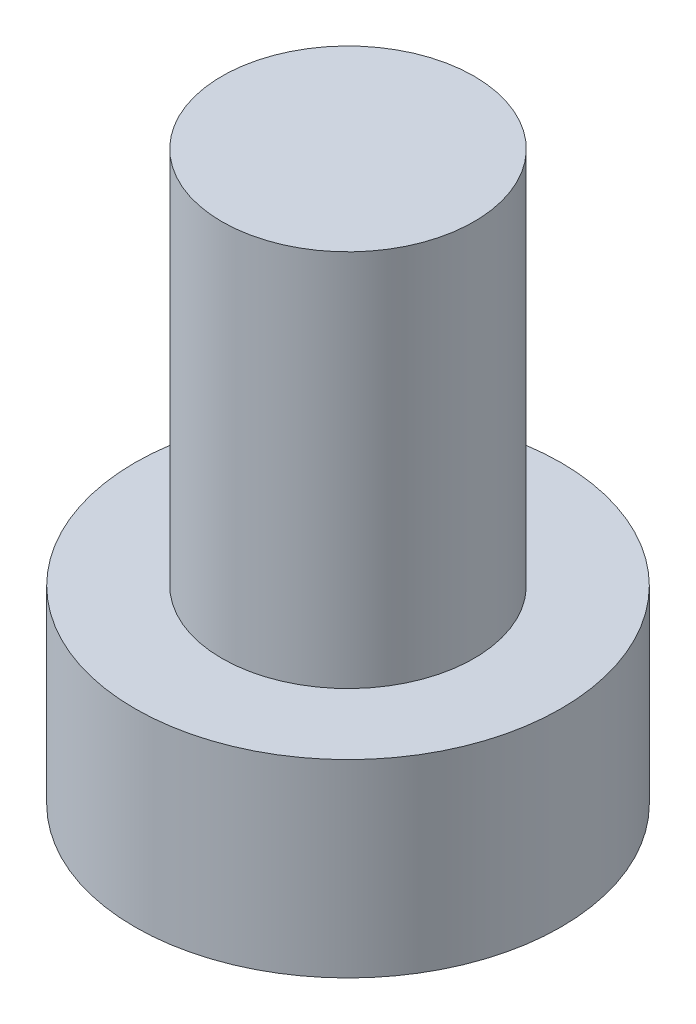
ISO-10303-21;
HEADER;
FILE_DESCRIPTION(('STEP AP214'),'2;1');
FILE_NAME('part.step','',(''),(''),'','','');
FILE_SCHEMA(('AUTOMOTIVE_DESIGN { 1 0 10303 214 1 1 1 1 }'));
ENDSEC;
DATA;
#1=APPLICATION_CONTEXT('core data for automotive mechanical design processes');
#2=APPLICATION_PROTOCOL_DEFINITION('international standard','automotive_design',2000,#1);
#3=PRODUCT_CONTEXT('',#1,'mechanical');
#4=PRODUCT('Part','Part','',(#3));
#5=PRODUCT_RELATED_PRODUCT_CATEGORY('part','',(#4));
#6=PRODUCT_DEFINITION_FORMATION('','',#4);
#7=PRODUCT_DEFINITION_CONTEXT('part definition',#1,'design');
#8=PRODUCT_DEFINITION('design','',#6,#7);
#9=PRODUCT_DEFINITION_SHAPE('','',#8);
#10=(LENGTH_UNIT() NAMED_UNIT(*) SI_UNIT(.MILLI.,.METRE.));
#11=(NAMED_UNIT(*) PLANE_ANGLE_UNIT() SI_UNIT($,.RADIAN.));
#12=(NAMED_UNIT(*) SI_UNIT($,.STERADIAN.) SOLID_ANGLE_UNIT());
#13=UNCERTAINTY_MEASURE_WITH_UNIT(LENGTH_MEASURE(1.E-05),#10,'distance_accuracy_value','');
#14=(GEOMETRIC_REPRESENTATION_CONTEXT(3) GLOBAL_UNCERTAINTY_ASSIGNED_CONTEXT((#13)) GLOBAL_UNIT_ASSIGNED_CONTEXT((#10,
#11,#12)) REPRESENTATION_CONTEXT('',''));
#15=CARTESIAN_POINT('',(0.,0.,0.));
#16=DIRECTION('',(0.,0.,1.));
#17=DIRECTION('',(1.,0.,0.));
#18=AXIS2_PLACEMENT_3D('',#15,#16,#17);
#19=CARTESIAN_POINT('',(0.,3.,0.));
#20=DIRECTION('',(0.,1.,0.));
#21=DIRECTION('',(0.,0.,1.));
#22=AXIS2_PLACEMENT_3D('',#19,#20,#21);
#23=PLANE('',#22);
#24=CARTESIAN_POINT('',(0.,3.,0.));
#25=DIRECTION('',(0.,1.,0.));
#26=DIRECTION('',(0.,0.,1.));
#27=AXIS2_PLACEMENT_3D('',#24,#25,#26);
#28=CIRCLE('',#27,3.38);
#29=CARTESIAN_POINT('',(0.,3.,3.38));
#30=VERTEX_POINT('',#29);
#31=EDGE_CURVE('E10',#30,#30,#28,.T.);
#32=ORIENTED_EDGE('',*,*,#31,.T.);
#33=EDGE_LOOP('',(#32));
#34=FACE_BOUND('',#33,.T.);
#35=CARTESIAN_POINT('',(0.,3.,0.));
#36=DIRECTION('',(0.,1.,0.));
#37=DIRECTION('',(0.,0.,1.));
#38=AXIS2_PLACEMENT_3D('',#35,#36,#37);
#39=CIRCLE('',#38,2.);
#40=CARTESIAN_POINT('',(0.,3.,2.));
#41=VERTEX_POINT('',#40);
#42=EDGE_CURVE('E42',#41,#41,#39,.T.);
#43=ORIENTED_EDGE('',*,*,#42,.F.);
#44=EDGE_LOOP('',(#43));
#45=FACE_BOUND('',#44,.T.);
#46=ADVANCED_FACE('F31',(#34,#45),#23,.T.);
#47=CARTESIAN_POINT('',(0.,0.,0.));
#48=DIRECTION('',(0.,1.,0.));
#49=DIRECTION('',(0.,0.,1.));
#50=AXIS2_PLACEMENT_3D('',#47,#48,#49);
#51=PLANE('',#50);
#52=CARTESIAN_POINT('',(0.,0.,0.));
#53=DIRECTION('',(0.,1.,0.));
#54=DIRECTION('',(0.,0.,1.));
#55=AXIS2_PLACEMENT_3D('',#52,#53,#54);
#56=CIRCLE('',#55,3.38);
#57=CARTESIAN_POINT('',(0.,0.,3.38));
#58=VERTEX_POINT('',#57);
#59=EDGE_CURVE('E35',#58,#58,#56,.T.);
#60=ORIENTED_EDGE('',*,*,#59,.F.);
#61=EDGE_LOOP('',(#60));
#62=FACE_BOUND('',#61,.T.);
#63=ADVANCED_FACE('F61',(#62),#51,.F.);
#64=CARTESIAN_POINT('',(0.,3.,0.));
#65=DIRECTION('',(0.,-1.,0.));
#66=DIRECTION('',(0.,0.,-1.));
#67=AXIS2_PLACEMENT_3D('',#64,#65,#66);
#68=CYLINDRICAL_SURFACE('',#67,3.38);
#69=ORIENTED_EDGE('',*,*,#31,.F.);
#70=EDGE_LOOP('',(#69));
#71=FACE_BOUND('',#70,.T.);
#72=ORIENTED_EDGE('',*,*,#59,.T.);
#73=EDGE_LOOP('',(#72));
#74=FACE_BOUND('',#73,.T.);
#75=ADVANCED_FACE('F33',(#71,#74),#68,.T.);
#76=CARTESIAN_POINT('',(0.,9.,0.));
#77=DIRECTION('',(0.,-1.,0.));
#78=DIRECTION('',(0.,0.,-1.));
#79=AXIS2_PLACEMENT_3D('',#76,#77,#78);
#80=CYLINDRICAL_SURFACE('',#79,2.);
#81=ORIENTED_EDGE('',*,*,#42,.T.);
#82=EDGE_LOOP('',(#81));
#83=FACE_BOUND('',#82,.T.);
#84=CARTESIAN_POINT('',(0.,9.,0.));
#85=DIRECTION('',(0.,1.,0.));
#86=DIRECTION('',(0.,0.,1.));
#87=AXIS2_PLACEMENT_3D('',#84,#85,#86);
#88=CIRCLE('',#87,2.);
#89=CARTESIAN_POINT('',(0.,9.,2.));
#90=VERTEX_POINT('',#89);
#91=EDGE_CURVE('E46',#90,#90,#88,.T.);
#92=ORIENTED_EDGE('',*,*,#91,.F.);
#93=EDGE_LOOP('',(#92));
#94=FACE_BOUND('',#93,.T.);
#95=ADVANCED_FACE('F52',(#83,#94),#80,.T.);
#96=CARTESIAN_POINT('',(0.,9.,0.));
#97=DIRECTION('',(0.,1.,0.));
#98=DIRECTION('',(0.,0.,1.));
#99=AXIS2_PLACEMENT_3D('',#96,#97,#98);
#100=PLANE('',#99);
#101=ORIENTED_EDGE('',*,*,#91,.T.);
#102=EDGE_LOOP('',(#101));
#103=FACE_BOUND('',#102,.T.);
#104=ADVANCED_FACE('F50',(#103),#100,.T.);
#105=CLOSED_SHELL('',(#46,#63,#75,#95,#104));
#106=MANIFOLD_SOLID_BREP('B2',#105);
#107=ADVANCED_BREP_SHAPE_REPRESENTATION('',(#18,#106),#14);
#108=SHAPE_DEFINITION_REPRESENTATION(#9,#107);
ENDSEC;
END-ISO-10303-21;
